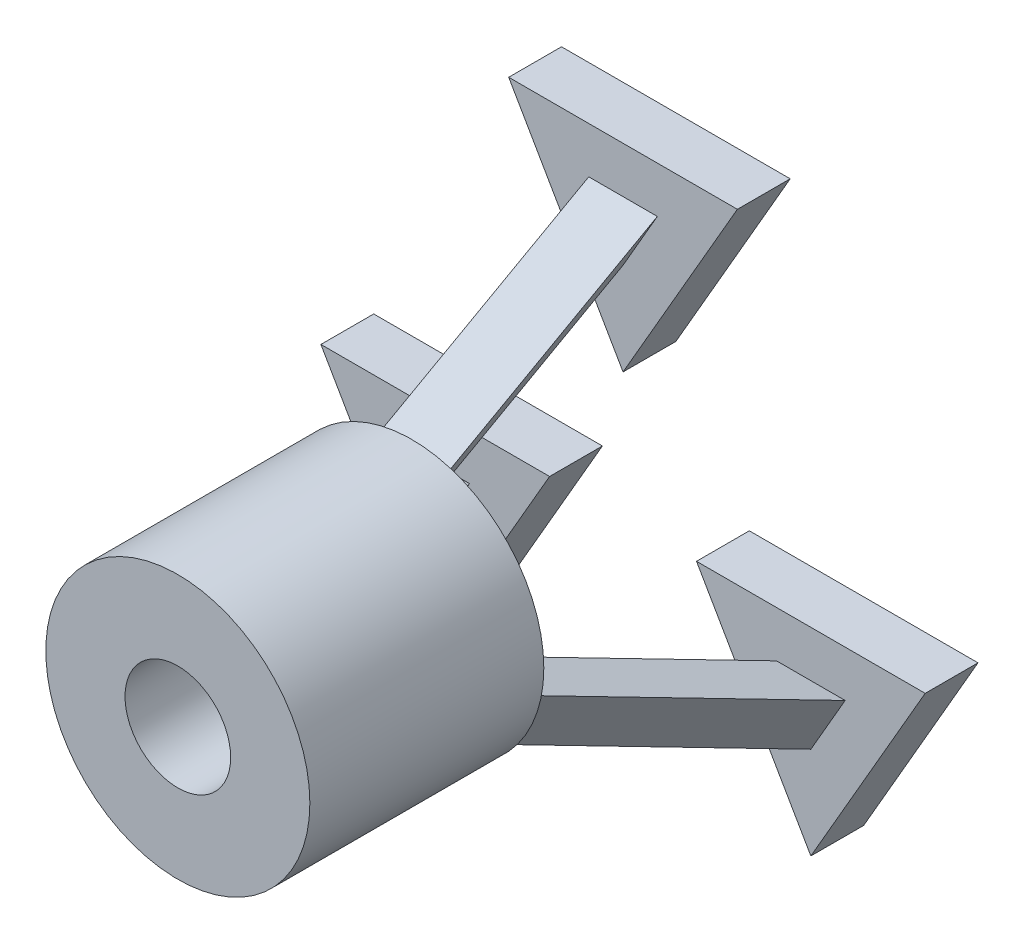
ISO-10303-21;
HEADER;
FILE_DESCRIPTION(('STEP AP214'),'2;1');
FILE_NAME('part.step','',(''),(''),'','','');
FILE_SCHEMA(('AUTOMOTIVE_DESIGN { 1 0 10303 214 1 1 1 1 }'));
ENDSEC;
DATA;
#1=APPLICATION_CONTEXT('core data for automotive mechanical design processes');
#2=APPLICATION_PROTOCOL_DEFINITION('international standard','automotive_design',2000,#1);
#3=PRODUCT_CONTEXT('',#1,'mechanical');
#4=PRODUCT('Part','Part','',(#3));
#5=PRODUCT_RELATED_PRODUCT_CATEGORY('part','',(#4));
#6=PRODUCT_DEFINITION_FORMATION('','',#4);
#7=PRODUCT_DEFINITION_CONTEXT('part definition',#1,'design');
#8=PRODUCT_DEFINITION('design','',#6,#7);
#9=PRODUCT_DEFINITION_SHAPE('','',#8);
#10=(LENGTH_UNIT() NAMED_UNIT(*) SI_UNIT(.MILLI.,.METRE.));
#11=(NAMED_UNIT(*) PLANE_ANGLE_UNIT() SI_UNIT($,.RADIAN.));
#12=(NAMED_UNIT(*) SI_UNIT($,.STERADIAN.) SOLID_ANGLE_UNIT());
#13=UNCERTAINTY_MEASURE_WITH_UNIT(LENGTH_MEASURE(1.E-05),#10,'distance_accuracy_value','');
#14=(GEOMETRIC_REPRESENTATION_CONTEXT(3) GLOBAL_UNCERTAINTY_ASSIGNED_CONTEXT((#13)) GLOBAL_UNIT_ASSIGNED_CONTEXT((#10,
#11,#12)) REPRESENTATION_CONTEXT('',''));
#15=CARTESIAN_POINT('',(0.,0.,0.));
#16=DIRECTION('',(0.,0.,1.));
#17=DIRECTION('',(1.,0.,0.));
#18=AXIS2_PLACEMENT_3D('',#15,#16,#17);
#19=CARTESIAN_POINT('',(0.,0.,2.));
#20=DIRECTION('',(0.,0.,-1.));
#21=DIRECTION('',(-1.,0.,0.));
#22=AXIS2_PLACEMENT_3D('',#19,#20,#21);
#23=CYLINDRICAL_SURFACE('',#22,2.);
#24=CARTESIAN_POINT('',(0.,0.,2.));
#25=DIRECTION('',(0.,0.,-1.));
#26=DIRECTION('',(-1.,0.,0.));
#27=AXIS2_PLACEMENT_3D('',#24,#25,#26);
#28=CIRCLE('',#27,2.);
#29=CARTESIAN_POINT('',(-2.,0.,2.));
#30=VERTEX_POINT('',#29);
#31=EDGE_CURVE('E12',#30,#30,#28,.T.);
#32=ORIENTED_EDGE('',*,*,#31,.T.);
#33=EDGE_LOOP('',(#32));
#34=FACE_BOUND('',#33,.T.);
#35=CARTESIAN_POINT('',(0.,0.,0.));
#36=DIRECTION('',(0.,0.,-1.));
#37=DIRECTION('',(-1.,0.,0.));
#38=AXIS2_PLACEMENT_3D('',#35,#36,#37);
#39=CIRCLE('',#38,2.);
#40=CARTESIAN_POINT('',(-2.,0.,0.));
#41=VERTEX_POINT('',#40);
#42=EDGE_CURVE('E68',#41,#41,#39,.T.);
#43=ORIENTED_EDGE('',*,*,#42,.F.);
#44=EDGE_LOOP('',(#43));
#45=FACE_BOUND('',#44,.T.);
#46=ADVANCED_FACE('F65',(#34,#45),#23,.T.);
#47=CARTESIAN_POINT('',(0.,0.,2.));
#48=DIRECTION('',(0.,0.,-1.));
#49=DIRECTION('',(-1.,0.,0.));
#50=AXIS2_PLACEMENT_3D('',#47,#48,#49);
#51=PLANE('',#50);
#52=ORIENTED_EDGE('',*,*,#31,.F.);
#53=EDGE_LOOP('',(#52));
#54=FACE_BOUND('',#53,.T.);
#55=ADVANCED_FACE('F80',(#54),#51,.F.);
#56=CARTESIAN_POINT('',(0.,0.,0.));
#57=DIRECTION('',(0.,0.,-1.));
#58=DIRECTION('',(-1.,0.,0.));
#59=AXIS2_PLACEMENT_3D('',#56,#57,#58);
#60=PLANE('',#59);
#61=ORIENTED_EDGE('',*,*,#42,.T.);
#62=EDGE_LOOP('',(#61));
#63=FACE_BOUND('',#62,.T.);
#64=ADVANCED_FACE('F77',(#63),#60,.T.);
#65=CLOSED_SHELL('',(#46,#55,#64));
#66=MANIFOLD_SOLID_BREP('B2',#65);
#67=CARTESIAN_POINT('',(0.,0.,8.86));
#68=DIRECTION('',(0.,0.,1.));
#69=DIRECTION('',(1.,0.,0.));
#70=AXIS2_PLACEMENT_3D('',#67,#68,#69);
#71=PLANE('',#70);
#72=CARTESIAN_POINT('',(0.,0.,8.86));
#73=DIRECTION('',(0.,0.,1.));
#74=DIRECTION('',(1.,0.,0.));
#75=AXIS2_PLACEMENT_3D('',#72,#73,#74);
#76=CIRCLE('',#75,5.);
#77=CARTESIAN_POINT('',(5.,0.,8.86));
#78=VERTEX_POINT('',#77);
#79=EDGE_CURVE('E63',#78,#78,#76,.T.);
#80=ORIENTED_EDGE('',*,*,#79,.T.);
#81=EDGE_LOOP('',(#80));
#82=FACE_BOUND('',#81,.T.);
#83=CARTESIAN_POINT('',(0.,0.,8.86));
#84=DIRECTION('',(0.,0.,1.));
#85=DIRECTION('',(1.,0.,0.));
#86=AXIS2_PLACEMENT_3D('',#83,#84,#85);
#87=CIRCLE('',#86,2.);
#88=CARTESIAN_POINT('',(2.,0.,8.86));
#89=VERTEX_POINT('',#88);
#90=EDGE_CURVE('E456',#89,#89,#87,.T.);
#91=ORIENTED_EDGE('',*,*,#90,.F.);
#92=EDGE_LOOP('',(#91));
#93=FACE_BOUND('',#92,.T.);
#94=ADVANCED_FACE('F106',(#82,#93),#71,.T.);
#95=CARTESIAN_POINT('',(0.,0.,0.));
#96=DIRECTION('',(0.,0.,1.));
#97=DIRECTION('',(1.,0.,0.));
#98=AXIS2_PLACEMENT_3D('',#95,#96,#97);
#99=PLANE('',#98);
#100=DIRECTION('',(-0.500000000000008,0.866025403784434,0.));
#101=VECTOR('',#100,1.);
#102=CARTESIAN_POINT('',(3.24999999999998,-3.37638837486622,0.));
#103=LINE('',#102,#101);
#104=CARTESIAN_POINT('',(3.24999999999998,-3.37638837486622,0.));
#105=VERTEX_POINT('',#104);
#106=CARTESIAN_POINT('',(1.9509618943233,-1.12638837486624,0.));
#107=VERTEX_POINT('',#106);
#108=EDGE_CURVE('E428',#105,#107,#103,.T.);
#109=ORIENTED_EDGE('',*,*,#108,.F.);
#110=DIRECTION('',(-0.499999999999992,-0.866025403784443,0.));
#111=VECTOR('',#110,1.);
#112=CARTESIAN_POINT('',(4.54903810567662,-1.12638837486621,0.));
#113=LINE('',#112,#111);
#114=CARTESIAN_POINT('',(4.54903810567662,-1.12638837486621,0.));
#115=VERTEX_POINT('',#114);
#116=EDGE_CURVE('E359',#115,#105,#113,.T.);
#117=ORIENTED_EDGE('',*,*,#116,.F.);
#118=DIRECTION('',(1.,0.,0.));
#119=VECTOR('',#118,1.);
#120=CARTESIAN_POINT('',(1.9509618943233,-1.12638837486624,0.));
#121=LINE('',#120,#119);
#122=EDGE_CURVE('E521',#107,#115,#121,.T.);
#123=ORIENTED_EDGE('',*,*,#122,.F.);
#124=EDGE_LOOP('',(#109,#117,#123));
#125=FACE_BOUND('',#124,.T.);
#126=DIRECTION('',(1.,0.,0.));
#127=VECTOR('',#126,1.);
#128=CARTESIAN_POINT('',(-4.5490381056766,-1.12638837486628,0.));
#129=LINE('',#128,#127);
#130=CARTESIAN_POINT('',(-4.5490381056766,-1.12638837486628,0.));
#131=VERTEX_POINT('',#130);
#132=CARTESIAN_POINT('',(-1.95096189432329,-1.12638837486626,0.));
#133=VERTEX_POINT('',#132);
#134=EDGE_CURVE('E493',#131,#133,#129,.T.);
#135=ORIENTED_EDGE('',*,*,#134,.F.);
#136=DIRECTION('',(-0.500000000000004,0.866025403784437,0.));
#137=VECTOR('',#136,1.);
#138=CARTESIAN_POINT('',(-3.24999999999993,-3.37638837486627,0.));
#139=LINE('',#138,#137);
#140=CARTESIAN_POINT('',(-3.24999999999993,-3.37638837486627,0.));
#141=VERTEX_POINT('',#140);
#142=EDGE_CURVE('E489',#141,#131,#139,.T.);
#143=ORIENTED_EDGE('',*,*,#142,.F.);
#144=DIRECTION('',(-0.499999999999996,-0.866025403784441,0.));
#145=VECTOR('',#144,1.);
#146=CARTESIAN_POINT('',(-1.95096189432329,-1.12638837486626,0.));
#147=LINE('',#146,#145);
#148=EDGE_CURVE('E836',#133,#141,#147,.T.);
#149=ORIENTED_EDGE('',*,*,#148,.F.);
#150=EDGE_LOOP('',(#135,#143,#149));
#151=FACE_BOUND('',#150,.T.);
#152=DIRECTION('',(-0.5,-0.866025403784439,0.));
#153=VECTOR('',#152,1.);
#154=CARTESIAN_POINT('',(1.29903810567666,4.50277674973251,0.));
#155=LINE('',#154,#153);
#156=CARTESIAN_POINT('',(1.29903810567666,4.50277674973251,0.));
#157=VERTEX_POINT('',#156);
#158=CARTESIAN_POINT('',(0.,2.25277674973251,0.));
#159=VERTEX_POINT('',#158);
#160=EDGE_CURVE('E466',#157,#159,#155,.T.);
#161=ORIENTED_EDGE('',*,*,#160,.F.);
#162=DIRECTION('',(1.,0.,0.));
#163=VECTOR('',#162,1.);
#164=CARTESIAN_POINT('',(-1.29903810567666,4.50277674973251,0.));
#165=LINE('',#164,#163);
#166=CARTESIAN_POINT('',(-1.29903810567666,4.50277674973251,0.));
#167=VERTEX_POINT('',#166);
#168=EDGE_CURVE('E470',#167,#157,#165,.T.);
#169=ORIENTED_EDGE('',*,*,#168,.F.);
#170=DIRECTION('',(-0.5,0.866025403784438,0.));
#171=VECTOR('',#170,1.);
#172=CARTESIAN_POINT('',(0.,2.25277674973251,0.));
#173=LINE('',#172,#171);
#174=EDGE_CURVE('E469',#159,#167,#173,.T.);
#175=ORIENTED_EDGE('',*,*,#174,.F.);
#176=EDGE_LOOP('',(#161,#169,#175));
#177=FACE_BOUND('',#176,.T.);
#178=CARTESIAN_POINT('',(0.,0.,0.));
#179=DIRECTION('',(0.,0.,1.));
#180=DIRECTION('',(1.,0.,0.));
#181=AXIS2_PLACEMENT_3D('',#178,#179,#180);
#182=CIRCLE('',#181,5.);
#183=CARTESIAN_POINT('',(5.,0.,0.));
#184=VERTEX_POINT('',#183);
#185=EDGE_CURVE('E117',#184,#184,#182,.T.);
#186=ORIENTED_EDGE('',*,*,#185,.F.);
#187=EDGE_LOOP('',(#186));
#188=FACE_BOUND('',#187,.T.);
#189=CARTESIAN_POINT('',(0.,0.,0.));
#190=DIRECTION('',(0.,0.,1.));
#191=DIRECTION('',(1.,0.,0.));
#192=AXIS2_PLACEMENT_3D('',#189,#190,#191);
#193=CIRCLE('',#192,2.);
#194=CARTESIAN_POINT('',(2.,0.,0.));
#195=VERTEX_POINT('',#194);
#196=EDGE_CURVE('E435',#195,#195,#193,.T.);
#197=ORIENTED_EDGE('',*,*,#196,.T.);
#198=EDGE_LOOP('',(#197));
#199=FACE_BOUND('',#198,.T.);
#200=ADVANCED_FACE('F495',(#125,#151,#177,#188,#199),#99,.F.);
#201=CARTESIAN_POINT('',(0.,0.,8.86));
#202=DIRECTION('',(0.,0.,-1.));
#203=DIRECTION('',(-1.,0.,0.));
#204=AXIS2_PLACEMENT_3D('',#201,#202,#203);
#205=CYLINDRICAL_SURFACE('',#204,5.);
#206=ORIENTED_EDGE('',*,*,#79,.F.);
#207=EDGE_LOOP('',(#206));
#208=FACE_BOUND('',#207,.T.);
#209=ORIENTED_EDGE('',*,*,#185,.T.);
#210=EDGE_LOOP('',(#209));
#211=FACE_BOUND('',#210,.T.);
#212=ADVANCED_FACE('F108',(#208,#211),#205,.T.);
#213=CARTESIAN_POINT('',(0.,0.,8.86));
#214=DIRECTION('',(0.,0.,-1.));
#215=DIRECTION('',(-1.,0.,0.));
#216=AXIS2_PLACEMENT_3D('',#213,#214,#215);
#217=CYLINDRICAL_SURFACE('',#216,2.);
#218=ORIENTED_EDGE('',*,*,#90,.T.);
#219=EDGE_LOOP('',(#218));
#220=FACE_BOUND('',#219,.T.);
#221=ORIENTED_EDGE('',*,*,#196,.F.);
#222=EDGE_LOOP('',(#221));
#223=FACE_BOUND('',#222,.T.);
#224=ADVANCED_FACE('F612',(#220,#223),#217,.F.);
#225=CARTESIAN_POINT('',(0.,3.43528589254037,1.91497683592465));
#226=DIRECTION('',(0.,0.873456408338461,0.486902354412541));
#227=DIRECTION('',(0.,-0.486902354412541,0.873456408338461));
#228=AXIS2_PLACEMENT_3D('',#225,#226,#227);
#229=PLANE('',#228);
#230=DIRECTION('',(0.,0.486902354412541,-0.873456408338461));
#231=VECTOR('',#230,1.);
#232=CARTESIAN_POINT('',(1.29903810567666,4.50277674973251,0.));
#233=LINE('',#232,#231);
#234=CARTESIAN_POINT('',(1.29903810567666,8.96232252455833,-8.));
#235=VERTEX_POINT('',#234);
#236=EDGE_CURVE('E476',#157,#235,#233,.T.);
#237=ORIENTED_EDGE('',*,*,#236,.T.);
#238=DIRECTION('',(-1.,0.,0.));
#239=VECTOR('',#238,1.);
#240=CARTESIAN_POINT('',(1.29903810567666,8.96232252455833,-8.));
#241=LINE('',#240,#239);
#242=CARTESIAN_POINT('',(-1.29903810567666,8.96232252455833,-8.));
#243=VERTEX_POINT('',#242);
#244=EDGE_CURVE('E363',#235,#243,#241,.T.);
#245=ORIENTED_EDGE('',*,*,#244,.T.);
#246=DIRECTION('',(0.,0.48690235441254,-0.873456408338461));
#247=VECTOR('',#246,1.);
#248=CARTESIAN_POINT('',(-1.29903810567666,4.50277674973251,0.));
#249=LINE('',#248,#247);
#250=EDGE_CURVE('E569',#167,#243,#249,.T.);
#251=ORIENTED_EDGE('',*,*,#250,.F.);
#252=ORIENTED_EDGE('',*,*,#168,.T.);
#253=EDGE_LOOP('',(#237,#245,#251,#252));
#254=FACE_BOUND('',#253,.T.);
#255=ADVANCED_FACE('F582',(#254),#229,.T.);
#256=CARTESIAN_POINT('',(0.905162715080996,0.522595937212426,0.291317562967102));
#257=DIRECTION('',(-0.834227619434107,-0.481641540645703,-0.268487812195893));
#258=DIRECTION('',(0.500000000000001,-0.866025403784438,0.));
#259=AXIS2_PLACEMENT_3D('',#256,#257,#258);
#260=PLANE('',#259);
#261=ORIENTED_EDGE('',*,*,#250,.T.);
#262=DIRECTION('',(0.500000000000001,-0.866025403784438,0.));
#263=VECTOR('',#262,1.);
#264=CARTESIAN_POINT('',(-1.29903810567666,8.96232252455833,-8.));
#265=LINE('',#264,#263);
#266=CARTESIAN_POINT('',(0.,6.71232252455834,-8.));
#267=VERTEX_POINT('',#266);
#268=EDGE_CURVE('E431',#243,#267,#265,.T.);
#269=ORIENTED_EDGE('',*,*,#268,.T.);
#270=DIRECTION('',(0.,0.486902354412541,-0.873456408338461));
#271=VECTOR('',#270,1.);
#272=CARTESIAN_POINT('',(0.,2.25277674973251,0.));
#273=LINE('',#272,#271);
#274=EDGE_CURVE('E441',#159,#267,#273,.T.);
#275=ORIENTED_EDGE('',*,*,#274,.F.);
#276=ORIENTED_EDGE('',*,*,#174,.T.);
#277=EDGE_LOOP('',(#261,#269,#275,#276));
#278=FACE_BOUND('',#277,.T.);
#279=ADVANCED_FACE('F584',(#278),#260,.T.);
#280=CARTESIAN_POINT('',(-0.905162715080993,0.522595937212424,0.291317562967101));
#281=DIRECTION('',(0.834227619434107,-0.481641540645702,-0.268487812195893));
#282=DIRECTION('',(0.5,0.866025403784439,0.));
#283=AXIS2_PLACEMENT_3D('',#280,#281,#282);
#284=PLANE('',#283);
#285=ORIENTED_EDGE('',*,*,#274,.T.);
#286=DIRECTION('',(0.5,0.866025403784439,0.));
#287=VECTOR('',#286,1.);
#288=CARTESIAN_POINT('',(0.,6.71232252455834,-8.));
#289=LINE('',#288,#287);
#290=EDGE_CURVE('E438',#267,#235,#289,.T.);
#291=ORIENTED_EDGE('',*,*,#290,.T.);
#292=ORIENTED_EDGE('',*,*,#236,.F.);
#293=ORIENTED_EDGE('',*,*,#160,.T.);
#294=EDGE_LOOP('',(#285,#291,#292,#293));
#295=FACE_BOUND('',#294,.T.);
#296=ADVANCED_FACE('F592',(#295),#284,.T.);
#297=CARTESIAN_POINT('',(-2.97504485220225,-1.7176429462702,1.91497683592465));
#298=DIRECTION('',(-0.756435438719419,-0.436728204169235,0.486902354412541));
#299=DIRECTION('',(0.421669808083713,0.243451177206272,0.873456408338461));
#300=AXIS2_PLACEMENT_3D('',#297,#298,#299);
#301=PLANE('',#300);
#302=DIRECTION('',(-0.421669808083713,-0.243451177206272,-0.873456408338461));
#303=VECTOR('',#302,1.);
#304=CARTESIAN_POINT('',(-4.5490381056766,-1.12638837486628,0.));
#305=LINE('',#304,#303);
#306=CARTESIAN_POINT('',(-8.41111803601532,-3.35616126227921,-8.));
#307=VERTEX_POINT('',#306);
#308=EDGE_CURVE('E133',#131,#307,#305,.T.);
#309=ORIENTED_EDGE('',*,*,#308,.T.);
#310=DIRECTION('',(0.500000000000005,-0.866025403784436,0.));
#311=VECTOR('',#310,1.);
#312=CARTESIAN_POINT('',(-8.41111803601532,-3.35616126227921,-8.));
#313=LINE('',#312,#311);
#314=CARTESIAN_POINT('',(-7.11207993033864,-5.6061612622792,-8.));
#315=VERTEX_POINT('',#314);
#316=EDGE_CURVE('E549',#307,#315,#313,.T.);
#317=ORIENTED_EDGE('',*,*,#316,.T.);
#318=DIRECTION('',(-0.421669808083713,-0.243451177206272,-0.873456408338461));
#319=VECTOR('',#318,1.);
#320=CARTESIAN_POINT('',(-3.24999999999993,-3.37638837486627,0.));
#321=LINE('',#320,#319);
#322=EDGE_CURVE('E835',#141,#315,#321,.T.);
#323=ORIENTED_EDGE('',*,*,#322,.F.);
#324=ORIENTED_EDGE('',*,*,#142,.T.);
#325=EDGE_LOOP('',(#309,#317,#323,#324));
#326=FACE_BOUND('',#325,.T.);
#327=ADVANCED_FACE('F594',(#326),#301,.T.);
#328=CARTESIAN_POINT('',(-0.905162715080999,0.522595937212421,0.291317562967102));
#329=DIRECTION('',(0.83422761943411,-0.481641540645698,-0.268487812195893));
#330=DIRECTION('',(0.499999999999995,0.866025403784442,0.));
#331=AXIS2_PLACEMENT_3D('',#328,#329,#330);
#332=PLANE('',#331);
#333=ORIENTED_EDGE('',*,*,#322,.T.);
#334=DIRECTION('',(0.499999999999995,0.866025403784441,0.));
#335=VECTOR('',#334,1.);
#336=CARTESIAN_POINT('',(-7.11207993033864,-5.6061612622792,-8.));
#337=LINE('',#336,#335);
#338=CARTESIAN_POINT('',(-5.813041824662,-3.3561612622792,-8.));
#339=VERTEX_POINT('',#338);
#340=EDGE_CURVE('E447',#315,#339,#337,.T.);
#341=ORIENTED_EDGE('',*,*,#340,.T.);
#342=DIRECTION('',(-0.421669808083714,-0.243451177206272,-0.873456408338461));
#343=VECTOR('',#342,1.);
#344=CARTESIAN_POINT('',(-1.95096189432329,-1.12638837486626,0.));
#345=LINE('',#344,#343);
#346=EDGE_CURVE('E831',#133,#339,#345,.T.);
#347=ORIENTED_EDGE('',*,*,#346,.F.);
#348=ORIENTED_EDGE('',*,*,#148,.T.);
#349=EDGE_LOOP('',(#333,#341,#347,#348));
#350=FACE_BOUND('',#349,.T.);
#351=ADVANCED_FACE('F600',(#350),#332,.T.);
#352=CARTESIAN_POINT('',(0.,-1.04519187442485,0.291317562967101));
#353=DIRECTION('',(0.,0.963283081291405,-0.268487812195893));
#354=DIRECTION('',(-1.,0.,0.));
#355=AXIS2_PLACEMENT_3D('',#352,#353,#354);
#356=PLANE('',#355);
#357=ORIENTED_EDGE('',*,*,#346,.T.);
#358=DIRECTION('',(-1.,0.,0.));
#359=VECTOR('',#358,1.);
#360=CARTESIAN_POINT('',(-5.813041824662,-3.3561612622792,-8.));
#361=LINE('',#360,#359);
#362=EDGE_CURVE('E558',#339,#307,#361,.T.);
#363=ORIENTED_EDGE('',*,*,#362,.T.);
#364=ORIENTED_EDGE('',*,*,#308,.F.);
#365=ORIENTED_EDGE('',*,*,#134,.T.);
#366=EDGE_LOOP('',(#357,#363,#364,#365));
#367=FACE_BOUND('',#366,.T.);
#368=ADVANCED_FACE('F401',(#367),#356,.T.);
#369=CARTESIAN_POINT('',(2.97504485220228,-1.71764294627015,1.91497683592465));
#370=DIRECTION('',(0.756435438719426,-0.436728204169222,0.486902354412541));
#371=DIRECTION('',(-0.421669808083717,0.243451177206266,0.873456408338461));
#372=AXIS2_PLACEMENT_3D('',#369,#370,#371);
#373=PLANE('',#372);
#374=DIRECTION('',(0.421669808083717,-0.243451177206266,-0.873456408338461));
#375=VECTOR('',#374,1.);
#376=CARTESIAN_POINT('',(3.24999999999998,-3.37638837486622,0.));
#377=LINE('',#376,#375);
#378=CARTESIAN_POINT('',(7.11207993033872,-5.6061612622791,-8.));
#379=VERTEX_POINT('',#378);
#380=EDGE_CURVE('E125',#105,#379,#377,.T.);
#381=ORIENTED_EDGE('',*,*,#380,.T.);
#382=DIRECTION('',(0.499999999999991,0.866025403784444,0.));
#383=VECTOR('',#382,1.);
#384=CARTESIAN_POINT('',(7.11207993033872,-5.6061612622791,-8.));
#385=LINE('',#384,#383);
#386=CARTESIAN_POINT('',(8.41111803601536,-3.35616126227909,-8.));
#387=VERTEX_POINT('',#386);
#388=EDGE_CURVE('E110',#379,#387,#385,.T.);
#389=ORIENTED_EDGE('',*,*,#388,.T.);
#390=DIRECTION('',(0.421669808083716,-0.243451177206266,-0.873456408338461));
#391=VECTOR('',#390,1.);
#392=CARTESIAN_POINT('',(4.54903810567662,-1.12638837486621,0.));
#393=LINE('',#392,#391);
#394=EDGE_CURVE('E530',#115,#387,#393,.T.);
#395=ORIENTED_EDGE('',*,*,#394,.F.);
#396=ORIENTED_EDGE('',*,*,#116,.T.);
#397=EDGE_LOOP('',(#381,#389,#395,#396));
#398=FACE_BOUND('',#397,.T.);
#399=ADVANCED_FACE('F396',(#398),#373,.T.);
#400=CARTESIAN_POINT('',(0.,-1.04519187442485,0.291317562967102));
#401=DIRECTION('',(0.,0.963283081291405,-0.268487812195893));
#402=DIRECTION('',(-1.,0.,0.));
#403=AXIS2_PLACEMENT_3D('',#400,#401,#402);
#404=PLANE('',#403);
#405=ORIENTED_EDGE('',*,*,#394,.T.);
#406=DIRECTION('',(-1.,0.,0.));
#407=VECTOR('',#406,1.);
#408=CARTESIAN_POINT('',(8.41111803601536,-3.35616126227909,-8.));
#409=LINE('',#408,#407);
#410=CARTESIAN_POINT('',(5.81304182466205,-3.35616126227911,-8.));
#411=VERTEX_POINT('',#410);
#412=EDGE_CURVE('E542',#387,#411,#409,.T.);
#413=ORIENTED_EDGE('',*,*,#412,.T.);
#414=DIRECTION('',(0.421669808083717,-0.243451177206267,-0.873456408338461));
#415=VECTOR('',#414,1.);
#416=CARTESIAN_POINT('',(1.9509618943233,-1.12638837486624,0.));
#417=LINE('',#416,#415);
#418=EDGE_CURVE('E369',#107,#411,#417,.T.);
#419=ORIENTED_EDGE('',*,*,#418,.F.);
#420=ORIENTED_EDGE('',*,*,#122,.T.);
#421=EDGE_LOOP('',(#405,#413,#419,#420));
#422=FACE_BOUND('',#421,.T.);
#423=ADVANCED_FACE('F400',(#422),#404,.T.);
#424=CARTESIAN_POINT('',(0.905162715080988,0.522595937212433,0.291317562967101));
#425=DIRECTION('',(-0.834227619434103,-0.48164154064571,-0.268487812195893));
#426=DIRECTION('',(0.500000000000008,-0.866025403784434,0.));
#427=AXIS2_PLACEMENT_3D('',#424,#425,#426);
#428=PLANE('',#427);
#429=ORIENTED_EDGE('',*,*,#418,.T.);
#430=DIRECTION('',(0.500000000000008,-0.866025403784434,0.));
#431=VECTOR('',#430,1.);
#432=CARTESIAN_POINT('',(5.81304182466205,-3.35616126227911,-8.));
#433=LINE('',#432,#431);
#434=EDGE_CURVE('E537',#411,#379,#433,.T.);
#435=ORIENTED_EDGE('',*,*,#434,.T.);
#436=ORIENTED_EDGE('',*,*,#380,.F.);
#437=ORIENTED_EDGE('',*,*,#108,.T.);
#438=EDGE_LOOP('',(#429,#435,#436,#437));
#439=FACE_BOUND('',#438,.T.);
#440=ADVANCED_FACE('F382',(#439),#428,.T.);
#441=CARTESIAN_POINT('',(0.,0.,-8.));
#442=DIRECTION('',(0.,0.,-1.));
#443=DIRECTION('',(-1.,0.,0.));
#444=AXIS2_PLACEMENT_3D('',#441,#442,#443);
#445=PLANE('',#444);
#446=DIRECTION('',(-0.5,-0.866025403784438,0.));
#447=VECTOR('',#446,1.);
#448=CARTESIAN_POINT('',(4.33012701892219,10.7123225245583,-8.));
#449=LINE('',#448,#447);
#450=CARTESIAN_POINT('',(4.33012701892219,10.7123225245583,-8.));
#451=VERTEX_POINT('',#450);
#452=CARTESIAN_POINT('',(0.,3.21232252455833,-8.));
#453=VERTEX_POINT('',#452);
#454=EDGE_CURVE('E338',#451,#453,#449,.T.);
#455=ORIENTED_EDGE('',*,*,#454,.F.);
#456=DIRECTION('',(1.,0.,0.));
#457=VECTOR('',#456,1.);
#458=CARTESIAN_POINT('',(-4.33012701892219,10.7123225245583,-8.));
#459=LINE('',#458,#457);
#460=CARTESIAN_POINT('',(-4.33012701892219,10.7123225245583,-8.));
#461=VERTEX_POINT('',#460);
#462=EDGE_CURVE('E331',#461,#451,#459,.T.);
#463=ORIENTED_EDGE('',*,*,#462,.F.);
#464=DIRECTION('',(-0.5,0.866025403784439,0.));
#465=VECTOR('',#464,1.);
#466=CARTESIAN_POINT('',(0.,3.21232252455833,-8.));
#467=LINE('',#466,#465);
#468=EDGE_CURVE('E342',#453,#461,#467,.T.);
#469=ORIENTED_EDGE('',*,*,#468,.F.);
#470=EDGE_LOOP('',(#455,#463,#469));
#471=FACE_BOUND('',#470,.T.);
#472=ORIENTED_EDGE('',*,*,#244,.F.);
#473=ORIENTED_EDGE('',*,*,#290,.F.);
#474=ORIENTED_EDGE('',*,*,#268,.F.);
#475=EDGE_LOOP('',(#472,#473,#474));
#476=FACE_BOUND('',#475,.T.);
#477=ADVANCED_FACE('F371',(#471,#476),#445,.F.);
#478=CARTESIAN_POINT('',(4.33012701892219,10.7123225245583,-10.));
#479=DIRECTION('',(-0.866025403784438,0.5,0.));
#480=DIRECTION('',(-0.5,-0.866025403784438,0.));
#481=AXIS2_PLACEMENT_3D('',#478,#479,#480);
#482=PLANE('',#481);
#483=ORIENTED_EDGE('',*,*,#454,.T.);
#484=DIRECTION('',(0.,0.,1.));
#485=VECTOR('',#484,1.);
#486=CARTESIAN_POINT('',(0.,3.21232252455833,-10.));
#487=LINE('',#486,#485);
#488=CARTESIAN_POINT('',(0.,3.21232252455833,-10.));
#489=VERTEX_POINT('',#488);
#490=EDGE_CURVE('E355',#489,#453,#487,.T.);
#491=ORIENTED_EDGE('',*,*,#490,.F.);
#492=DIRECTION('',(-0.5,-0.866025403784438,0.));
#493=VECTOR('',#492,1.);
#494=CARTESIAN_POINT('',(4.33012701892219,10.7123225245583,-10.));
#495=LINE('',#494,#493);
#496=CARTESIAN_POINT('',(4.33012701892219,10.7123225245583,-10.));
#497=VERTEX_POINT('',#496);
#498=EDGE_CURVE('E321',#497,#489,#495,.T.);
#499=ORIENTED_EDGE('',*,*,#498,.F.);
#500=DIRECTION('',(0.,0.,1.));
#501=VECTOR('',#500,1.);
#502=CARTESIAN_POINT('',(4.33012701892219,10.7123225245583,-10.));
#503=LINE('',#502,#501);
#504=EDGE_CURVE('E337',#497,#451,#503,.T.);
#505=ORIENTED_EDGE('',*,*,#504,.T.);
#506=EDGE_LOOP('',(#483,#491,#499,#505));
#507=FACE_BOUND('',#506,.T.);
#508=ADVANCED_FACE('F381',(#507),#482,.F.);
#509=CARTESIAN_POINT('',(0.,3.21232252455833,-10.));
#510=DIRECTION('',(0.866025403784439,0.5,0.));
#511=DIRECTION('',(-0.5,0.866025403784439,0.));
#512=AXIS2_PLACEMENT_3D('',#509,#510,#511);
#513=PLANE('',#512);
#514=ORIENTED_EDGE('',*,*,#468,.T.);
#515=DIRECTION('',(0.,0.,1.));
#516=VECTOR('',#515,1.);
#517=CARTESIAN_POINT('',(-4.33012701892219,10.7123225245583,-10.));
#518=LINE('',#517,#516);
#519=CARTESIAN_POINT('',(-4.33012701892219,10.7123225245583,-10.));
#520=VERTEX_POINT('',#519);
#521=EDGE_CURVE('E351',#520,#461,#518,.T.);
#522=ORIENTED_EDGE('',*,*,#521,.F.);
#523=DIRECTION('',(-0.5,0.866025403784439,0.));
#524=VECTOR('',#523,1.);
#525=CARTESIAN_POINT('',(0.,3.21232252455833,-10.));
#526=LINE('',#525,#524);
#527=EDGE_CURVE('E330',#489,#520,#526,.T.);
#528=ORIENTED_EDGE('',*,*,#527,.F.);
#529=ORIENTED_EDGE('',*,*,#490,.T.);
#530=EDGE_LOOP('',(#514,#522,#528,#529));
#531=FACE_BOUND('',#530,.T.);
#532=ADVANCED_FACE('F388',(#531),#513,.F.);
#533=CARTESIAN_POINT('',(-4.33012701892219,10.7123225245583,-10.));
#534=DIRECTION('',(0.,-1.,0.));
#535=DIRECTION('',(1.,0.,0.));
#536=AXIS2_PLACEMENT_3D('',#533,#534,#535);
#537=PLANE('',#536);
#538=ORIENTED_EDGE('',*,*,#462,.T.);
#539=ORIENTED_EDGE('',*,*,#504,.F.);
#540=DIRECTION('',(1.,0.,0.));
#541=VECTOR('',#540,1.);
#542=CARTESIAN_POINT('',(-4.33012701892219,10.7123225245583,-10.));
#543=LINE('',#542,#541);
#544=EDGE_CURVE('E334',#520,#497,#543,.T.);
#545=ORIENTED_EDGE('',*,*,#544,.F.);
#546=ORIENTED_EDGE('',*,*,#521,.T.);
#547=EDGE_LOOP('',(#538,#539,#545,#546));
#548=FACE_BOUND('',#547,.T.);
#549=ADVANCED_FACE('F385',(#548),#537,.F.);
#550=CARTESIAN_POINT('',(0.,0.,-10.));
#551=DIRECTION('',(0.,0.,-1.));
#552=DIRECTION('',(-1.,0.,0.));
#553=AXIS2_PLACEMENT_3D('',#550,#551,#552);
#554=PLANE('',#553);
#555=ORIENTED_EDGE('',*,*,#498,.T.);
#556=ORIENTED_EDGE('',*,*,#527,.T.);
#557=ORIENTED_EDGE('',*,*,#544,.T.);
#558=EDGE_LOOP('',(#555,#556,#557));
#559=FACE_BOUND('',#558,.T.);
#560=ADVANCED_FACE('F312',(#559),#554,.T.);
#561=CARTESIAN_POINT('',(0.,0.,-8.));
#562=DIRECTION('',(0.,0.,-1.));
#563=DIRECTION('',(0.500000000000004,-0.866025403784436,0.));
#564=AXIS2_PLACEMENT_3D('',#561,#562,#563);
#565=PLANE('',#564);
#566=DIRECTION('',(1.,0.,0.));
#567=VECTOR('',#566,1.);
#568=CARTESIAN_POINT('',(-11.4422069492609,-1.60616126227922,-8.));
#569=LINE('',#568,#567);
#570=CARTESIAN_POINT('',(-11.4422069492609,-1.60616126227922,-8.));
#571=VERTEX_POINT('',#570);
#572=CARTESIAN_POINT('',(-2.78195291141647,-1.60616126227918,-8.));
#573=VERTEX_POINT('',#572);
#574=EDGE_CURVE('E263',#571,#573,#569,.T.);
#575=ORIENTED_EDGE('',*,*,#574,.F.);
#576=DIRECTION('',(-0.500000000000004,0.866025403784437,0.));
#577=VECTOR('',#576,1.);
#578=CARTESIAN_POINT('',(-7.11207993033863,-9.1061612622792,-8.));
#579=LINE('',#578,#577);
#580=CARTESIAN_POINT('',(-7.11207993033863,-9.1061612622792,-8.));
#581=VERTEX_POINT('',#580);
#582=EDGE_CURVE('E799',#581,#571,#579,.T.);
#583=ORIENTED_EDGE('',*,*,#582,.F.);
#584=DIRECTION('',(-0.499999999999996,-0.866025403784441,0.));
#585=VECTOR('',#584,1.);
#586=CARTESIAN_POINT('',(-2.78195291141647,-1.60616126227918,-8.));
#587=LINE('',#586,#585);
#588=EDGE_CURVE('E268',#573,#581,#587,.T.);
#589=ORIENTED_EDGE('',*,*,#588,.F.);
#590=EDGE_LOOP('',(#575,#583,#589));
#591=FACE_BOUND('',#590,.T.);
#592=ORIENTED_EDGE('',*,*,#316,.F.);
#593=ORIENTED_EDGE('',*,*,#362,.F.);
#594=ORIENTED_EDGE('',*,*,#340,.F.);
#595=EDGE_LOOP('',(#592,#593,#594));
#596=FACE_BOUND('',#595,.T.);
#597=ADVANCED_FACE('F307',(#591,#596),#565,.F.);
#598=CARTESIAN_POINT('',(-11.4422069492609,-1.60616126227922,-10.));
#599=DIRECTION('',(0.,-1.,0.));
#600=DIRECTION('',(1.,0.,0.));
#601=AXIS2_PLACEMENT_3D('',#598,#599,#600);
#602=PLANE('',#601);
#603=ORIENTED_EDGE('',*,*,#574,.T.);
#604=DIRECTION('',(0.,0.,1.));
#605=VECTOR('',#604,1.);
#606=CARTESIAN_POINT('',(-2.78195291141647,-1.60616126227918,-10.));
#607=LINE('',#606,#605);
#608=CARTESIAN_POINT('',(-2.78195291141647,-1.60616126227918,-10.));
#609=VERTEX_POINT('',#608);
#610=EDGE_CURVE('E343',#609,#573,#607,.T.);
#611=ORIENTED_EDGE('',*,*,#610,.F.);
#612=DIRECTION('',(1.,0.,0.));
#613=VECTOR('',#612,1.);
#614=CARTESIAN_POINT('',(-11.4422069492609,-1.60616126227922,-10.));
#615=LINE('',#614,#613);
#616=CARTESIAN_POINT('',(-11.4422069492609,-1.60616126227922,-10.));
#617=VERTEX_POINT('',#616);
#618=EDGE_CURVE('E281',#617,#609,#615,.T.);
#619=ORIENTED_EDGE('',*,*,#618,.F.);
#620=DIRECTION('',(0.,0.,1.));
#621=VECTOR('',#620,1.);
#622=CARTESIAN_POINT('',(-11.4422069492609,-1.60616126227922,-10.));
#623=LINE('',#622,#621);
#624=EDGE_CURVE('E802',#617,#571,#623,.T.);
#625=ORIENTED_EDGE('',*,*,#624,.T.);
#626=EDGE_LOOP('',(#603,#611,#619,#625));
#627=FACE_BOUND('',#626,.T.);
#628=ADVANCED_FACE('F311',(#627),#602,.F.);
#629=CARTESIAN_POINT('',(-2.78195291141647,-1.60616126227918,-10.));
#630=DIRECTION('',(-0.866025403784441,0.499999999999996,0.));
#631=DIRECTION('',(-0.499999999999996,-0.866025403784441,0.));
#632=AXIS2_PLACEMENT_3D('',#629,#630,#631);
#633=PLANE('',#632);
#634=ORIENTED_EDGE('',*,*,#588,.T.);
#635=DIRECTION('',(0.,0.,1.));
#636=VECTOR('',#635,1.);
#637=CARTESIAN_POINT('',(-7.11207993033863,-9.1061612622792,-10.));
#638=LINE('',#637,#636);
#639=CARTESIAN_POINT('',(-7.11207993033863,-9.1061612622792,-10.));
#640=VERTEX_POINT('',#639);
#641=EDGE_CURVE('E805',#640,#581,#638,.T.);
#642=ORIENTED_EDGE('',*,*,#641,.F.);
#643=DIRECTION('',(-0.499999999999996,-0.866025403784441,0.));
#644=VECTOR('',#643,1.);
#645=CARTESIAN_POINT('',(-2.78195291141647,-1.60616126227918,-10.));
#646=LINE('',#645,#644);
#647=EDGE_CURVE('E818',#609,#640,#646,.T.);
#648=ORIENTED_EDGE('',*,*,#647,.F.);
#649=ORIENTED_EDGE('',*,*,#610,.T.);
#650=EDGE_LOOP('',(#634,#642,#648,#649));
#651=FACE_BOUND('',#650,.T.);
#652=ADVANCED_FACE('F739',(#651),#633,.F.);
#653=CARTESIAN_POINT('',(-7.11207993033863,-9.1061612622792,-10.));
#654=DIRECTION('',(0.866025403784437,0.500000000000003,0.));
#655=DIRECTION('',(-0.500000000000003,0.866025403784437,0.));
#656=AXIS2_PLACEMENT_3D('',#653,#654,#655);
#657=PLANE('',#656);
#658=ORIENTED_EDGE('',*,*,#582,.T.);
#659=ORIENTED_EDGE('',*,*,#624,.F.);
#660=DIRECTION('',(-0.500000000000004,0.866025403784437,0.));
#661=VECTOR('',#660,1.);
#662=CARTESIAN_POINT('',(-7.11207993033863,-9.1061612622792,-10.));
#663=LINE('',#662,#661);
#664=EDGE_CURVE('E812',#640,#617,#663,.T.);
#665=ORIENTED_EDGE('',*,*,#664,.F.);
#666=ORIENTED_EDGE('',*,*,#641,.T.);
#667=EDGE_LOOP('',(#658,#659,#665,#666));
#668=FACE_BOUND('',#667,.T.);
#669=ADVANCED_FACE('F305',(#668),#657,.F.);
#670=CARTESIAN_POINT('',(0.,0.,-10.));
#671=DIRECTION('',(0.,0.,-1.));
#672=DIRECTION('',(0.500000000000004,-0.866025403784436,0.));
#673=AXIS2_PLACEMENT_3D('',#670,#671,#672);
#674=PLANE('',#673);
#675=ORIENTED_EDGE('',*,*,#618,.T.);
#676=ORIENTED_EDGE('',*,*,#647,.T.);
#677=ORIENTED_EDGE('',*,*,#664,.T.);
#678=EDGE_LOOP('',(#675,#676,#677));
#679=FACE_BOUND('',#678,.T.);
#680=ADVANCED_FACE('F293',(#679),#674,.T.);
#681=CARTESIAN_POINT('',(0.,0.,-8.));
#682=DIRECTION('',(0.,0.,-1.));
#683=DIRECTION('',(0.499999999999992,0.866025403784443,0.));
#684=AXIS2_PLACEMENT_3D('',#681,#682,#683);
#685=PLANE('',#684);
#686=DIRECTION('',(-0.500000000000008,0.866025403784434,0.));
#687=VECTOR('',#686,1.);
#688=CARTESIAN_POINT('',(7.11207993033875,-9.1061612622791,-8.));
#689=LINE('',#688,#687);
#690=CARTESIAN_POINT('',(7.11207993033875,-9.1061612622791,-8.));
#691=VERTEX_POINT('',#690);
#692=CARTESIAN_POINT('',(2.78195291141649,-1.60616126227914,-8.));
#693=VERTEX_POINT('',#692);
#694=EDGE_CURVE('E261',#691,#693,#689,.T.);
#695=ORIENTED_EDGE('',*,*,#694,.F.);
#696=DIRECTION('',(-0.499999999999992,-0.866025403784443,0.));
#697=VECTOR('',#696,1.);
#698=CARTESIAN_POINT('',(11.4422069492609,-1.60616126227906,-8.));
#699=LINE('',#698,#697);
#700=CARTESIAN_POINT('',(11.4422069492609,-1.60616126227906,-8.));
#701=VERTEX_POINT('',#700);
#702=EDGE_CURVE('E257',#701,#691,#699,.T.);
#703=ORIENTED_EDGE('',*,*,#702,.F.);
#704=DIRECTION('',(1.,0.,0.));
#705=VECTOR('',#704,1.);
#706=CARTESIAN_POINT('',(2.78195291141649,-1.60616126227914,-8.));
#707=LINE('',#706,#705);
#708=EDGE_CURVE('E900',#693,#701,#707,.T.);
#709=ORIENTED_EDGE('',*,*,#708,.F.);
#710=EDGE_LOOP('',(#695,#703,#709));
#711=FACE_BOUND('',#710,.T.);
#712=ORIENTED_EDGE('',*,*,#388,.F.);
#713=ORIENTED_EDGE('',*,*,#434,.F.);
#714=ORIENTED_EDGE('',*,*,#412,.F.);
#715=EDGE_LOOP('',(#712,#713,#714));
#716=FACE_BOUND('',#715,.T.);
#717=ADVANCED_FACE('F283',(#711,#716),#685,.F.);
#718=CARTESIAN_POINT('',(7.11207993033875,-9.1061612622791,-10.));
#719=DIRECTION('',(0.866025403784434,0.500000000000008,0.));
#720=DIRECTION('',(-0.500000000000008,0.866025403784434,0.));
#721=AXIS2_PLACEMENT_3D('',#718,#719,#720);
#722=PLANE('',#721);
#723=ORIENTED_EDGE('',*,*,#694,.T.);
#724=DIRECTION('',(0.,0.,1.));
#725=VECTOR('',#724,1.);
#726=CARTESIAN_POINT('',(2.78195291141649,-1.60616126227914,-10.));
#727=LINE('',#726,#725);
#728=CARTESIAN_POINT('',(2.78195291141649,-1.60616126227914,-10.));
#729=VERTEX_POINT('',#728);
#730=EDGE_CURVE('E241',#729,#693,#727,.T.);
#731=ORIENTED_EDGE('',*,*,#730,.F.);
#732=DIRECTION('',(-0.500000000000008,0.866025403784434,0.));
#733=VECTOR('',#732,1.);
#734=CARTESIAN_POINT('',(7.11207993033875,-9.1061612622791,-10.));
#735=LINE('',#734,#733);
#736=CARTESIAN_POINT('',(7.11207993033875,-9.1061612622791,-10.));
#737=VERTEX_POINT('',#736);
#738=EDGE_CURVE('E249',#737,#729,#735,.T.);
#739=ORIENTED_EDGE('',*,*,#738,.F.);
#740=DIRECTION('',(0.,0.,1.));
#741=VECTOR('',#740,1.);
#742=CARTESIAN_POINT('',(7.11207993033875,-9.1061612622791,-10.));
#743=LINE('',#742,#741);
#744=EDGE_CURVE('E270',#737,#691,#743,.T.);
#745=ORIENTED_EDGE('',*,*,#744,.T.);
#746=EDGE_LOOP('',(#723,#731,#739,#745));
#747=FACE_BOUND('',#746,.T.);
#748=ADVANCED_FACE('F259',(#747),#722,.F.);
#749=CARTESIAN_POINT('',(2.78195291141649,-1.60616126227914,-10.));
#750=DIRECTION('',(0.,-1.,0.));
#751=DIRECTION('',(1.,0.,0.));
#752=AXIS2_PLACEMENT_3D('',#749,#750,#751);
#753=PLANE('',#752);
#754=ORIENTED_EDGE('',*,*,#708,.T.);
#755=DIRECTION('',(0.,0.,1.));
#756=VECTOR('',#755,1.);
#757=CARTESIAN_POINT('',(11.4422069492609,-1.60616126227906,-10.));
#758=LINE('',#757,#756);
#759=CARTESIAN_POINT('',(11.4422069492609,-1.60616126227906,-10.));
#760=VERTEX_POINT('',#759);
#761=EDGE_CURVE('E244',#760,#701,#758,.T.);
#762=ORIENTED_EDGE('',*,*,#761,.F.);
#763=DIRECTION('',(1.,0.,0.));
#764=VECTOR('',#763,1.);
#765=CARTESIAN_POINT('',(2.78195291141649,-1.60616126227914,-10.));
#766=LINE('',#765,#764);
#767=EDGE_CURVE('E237',#729,#760,#766,.T.);
#768=ORIENTED_EDGE('',*,*,#767,.F.);
#769=ORIENTED_EDGE('',*,*,#730,.T.);
#770=EDGE_LOOP('',(#754,#762,#768,#769));
#771=FACE_BOUND('',#770,.T.);
#772=ADVANCED_FACE('F239',(#771),#753,.F.);
#773=CARTESIAN_POINT('',(11.4422069492609,-1.60616126227906,-10.));
#774=DIRECTION('',(-0.866025403784443,0.499999999999993,0.));
#775=DIRECTION('',(-0.499999999999992,-0.866025403784443,0.));
#776=AXIS2_PLACEMENT_3D('',#773,#774,#775);
#777=PLANE('',#776);
#778=ORIENTED_EDGE('',*,*,#702,.T.);
#779=ORIENTED_EDGE('',*,*,#744,.F.);
#780=DIRECTION('',(-0.499999999999992,-0.866025403784443,0.));
#781=VECTOR('',#780,1.);
#782=CARTESIAN_POINT('',(11.4422069492609,-1.60616126227906,-10.));
#783=LINE('',#782,#781);
#784=EDGE_CURVE('E248',#760,#737,#783,.T.);
#785=ORIENTED_EDGE('',*,*,#784,.F.);
#786=ORIENTED_EDGE('',*,*,#761,.T.);
#787=EDGE_LOOP('',(#778,#779,#785,#786));
#788=FACE_BOUND('',#787,.T.);
#789=ADVANCED_FACE('F295',(#788),#777,.F.);
#790=CARTESIAN_POINT('',(0.,0.,-10.));
#791=DIRECTION('',(0.,0.,-1.));
#792=DIRECTION('',(0.499999999999992,0.866025403784443,0.));
#793=AXIS2_PLACEMENT_3D('',#790,#791,#792);
#794=PLANE('',#793);
#795=ORIENTED_EDGE('',*,*,#738,.T.);
#796=ORIENTED_EDGE('',*,*,#767,.T.);
#797=ORIENTED_EDGE('',*,*,#784,.T.);
#798=EDGE_LOOP('',(#795,#796,#797));
#799=FACE_BOUND('',#798,.T.);
#800=ADVANCED_FACE('F252',(#799),#794,.T.);
#801=CLOSED_SHELL('',(#94,#200,#212,#224,#255,#279,#296,#327,#351,#368,#399,#423,#440,#477,#508,
#532,#549,#560,#597,#628,#652,#669,#680,#717,#748,#772,#789,#800));
#802=MANIFOLD_SOLID_BREP('B7',#801);
#803=ADVANCED_BREP_SHAPE_REPRESENTATION('',(#18,#66,#802),#14);
#804=SHAPE_DEFINITION_REPRESENTATION(#9,#803);
ENDSEC;
END-ISO-10303-21;
